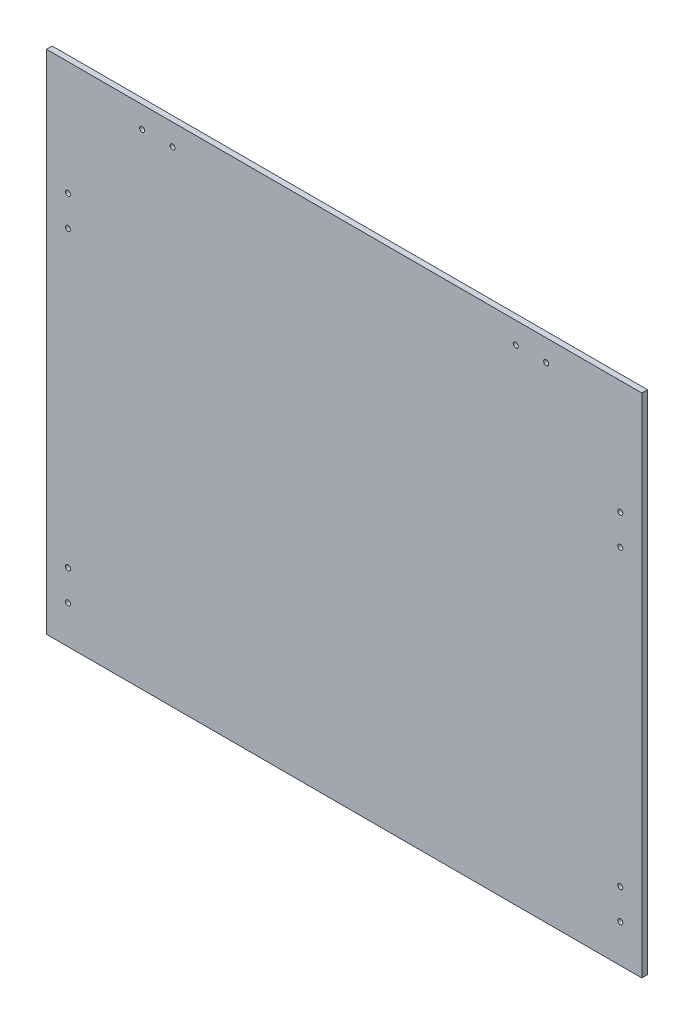
ISO-10303-21;
HEADER;
FILE_DESCRIPTION(('STEP AP214'),'2;1');
FILE_NAME('part.step','',(''),(''),'','','');
FILE_SCHEMA(('AUTOMOTIVE_DESIGN { 1 0 10303 214 1 1 1 1 }'));
ENDSEC;
DATA;
#1=APPLICATION_CONTEXT('core data for automotive mechanical design processes');
#2=APPLICATION_PROTOCOL_DEFINITION('international standard','automotive_design',2000,#1);
#3=PRODUCT_CONTEXT('',#1,'mechanical');
#4=PRODUCT('Part','Part','',(#3));
#5=PRODUCT_RELATED_PRODUCT_CATEGORY('part','',(#4));
#6=PRODUCT_DEFINITION_FORMATION('','',#4);
#7=PRODUCT_DEFINITION_CONTEXT('part definition',#1,'design');
#8=PRODUCT_DEFINITION('design','',#6,#7);
#9=PRODUCT_DEFINITION_SHAPE('','',#8);
#10=(LENGTH_UNIT() NAMED_UNIT(*) SI_UNIT(.MILLI.,.METRE.));
#11=(NAMED_UNIT(*) PLANE_ANGLE_UNIT() SI_UNIT($,.RADIAN.));
#12=(NAMED_UNIT(*) SI_UNIT($,.STERADIAN.) SOLID_ANGLE_UNIT());
#13=UNCERTAINTY_MEASURE_WITH_UNIT(LENGTH_MEASURE(1.E-05),#10,'distance_accuracy_value','');
#14=(GEOMETRIC_REPRESENTATION_CONTEXT(3) GLOBAL_UNCERTAINTY_ASSIGNED_CONTEXT((#13)) GLOBAL_UNIT_ASSIGNED_CONTEXT((#10,
#11,#12)) REPRESENTATION_CONTEXT('',''));
#15=CARTESIAN_POINT('',(0.,0.,0.));
#16=DIRECTION('',(0.,0.,1.));
#17=DIRECTION('',(1.,0.,0.));
#18=AXIS2_PLACEMENT_3D('',#15,#16,#17);
#19=CARTESIAN_POINT('',(0.,0.,4.5));
#20=DIRECTION('',(1.,0.,0.));
#21=DIRECTION('',(0.,1.,0.));
#22=AXIS2_PLACEMENT_3D('',#19,#20,#21);
#23=PLANE('',#22);
#24=DIRECTION('',(0.,-1.,0.));
#25=VECTOR('',#24,1.);
#26=CARTESIAN_POINT('',(0.,0.,0.));
#27=LINE('',#26,#25);
#28=CARTESIAN_POINT('',(0.,400.,0.));
#29=VERTEX_POINT('',#28);
#30=CARTESIAN_POINT('',(0.,0.,0.));
#31=VERTEX_POINT('',#30);
#32=EDGE_CURVE('E104',#29,#31,#27,.T.);
#33=ORIENTED_EDGE('',*,*,#32,.T.);
#34=DIRECTION('',(0.,0.,-1.));
#35=VECTOR('',#34,1.);
#36=CARTESIAN_POINT('',(0.,0.,4.5));
#37=LINE('',#36,#35);
#38=CARTESIAN_POINT('',(0.,0.,4.5));
#39=VERTEX_POINT('',#38);
#40=EDGE_CURVE('E11',#39,#31,#37,.T.);
#41=ORIENTED_EDGE('',*,*,#40,.F.);
#42=DIRECTION('',(0.,-1.,0.));
#43=VECTOR('',#42,1.);
#44=CARTESIAN_POINT('',(0.,0.,4.5));
#45=LINE('',#44,#43);
#46=CARTESIAN_POINT('',(0.,400.,4.5));
#47=VERTEX_POINT('',#46);
#48=EDGE_CURVE('E91',#47,#39,#45,.T.);
#49=ORIENTED_EDGE('',*,*,#48,.F.);
#50=DIRECTION('',(0.,0.,-1.));
#51=VECTOR('',#50,1.);
#52=CARTESIAN_POINT('',(0.,400.,4.5));
#53=LINE('',#52,#51);
#54=EDGE_CURVE('E100',#47,#29,#53,.T.);
#55=ORIENTED_EDGE('',*,*,#54,.T.);
#56=EDGE_LOOP('',(#33,#41,#49,#55));
#57=FACE_BOUND('',#56,.T.);
#58=ADVANCED_FACE('F38',(#57),#23,.F.);
#59=CARTESIAN_POINT('',(0.,0.,4.5));
#60=DIRECTION('',(0.,1.,0.));
#61=DIRECTION('',(0.,0.,1.));
#62=AXIS2_PLACEMENT_3D('',#59,#60,#61);
#63=PLANE('',#62);
#64=DIRECTION('',(1.,0.,0.));
#65=VECTOR('',#64,1.);
#66=CARTESIAN_POINT('',(0.,0.,0.));
#67=LINE('',#66,#65);
#68=CARTESIAN_POINT('',(470.,0.,0.));
#69=VERTEX_POINT('',#68);
#70=EDGE_CURVE('E95',#31,#69,#67,.T.);
#71=ORIENTED_EDGE('',*,*,#70,.T.);
#72=DIRECTION('',(0.,0.,-1.));
#73=VECTOR('',#72,1.);
#74=CARTESIAN_POINT('',(470.,0.,4.5));
#75=LINE('',#74,#73);
#76=CARTESIAN_POINT('',(470.,0.,4.5));
#77=VERTEX_POINT('',#76);
#78=EDGE_CURVE('E47',#77,#69,#75,.T.);
#79=ORIENTED_EDGE('',*,*,#78,.F.);
#80=DIRECTION('',(1.,0.,0.));
#81=VECTOR('',#80,1.);
#82=CARTESIAN_POINT('',(0.,0.,4.5));
#83=LINE('',#82,#81);
#84=EDGE_CURVE('E86',#39,#77,#83,.T.);
#85=ORIENTED_EDGE('',*,*,#84,.F.);
#86=ORIENTED_EDGE('',*,*,#40,.T.);
#87=EDGE_LOOP('',(#71,#79,#85,#86));
#88=FACE_BOUND('',#87,.T.);
#89=ADVANCED_FACE('F94',(#88),#63,.F.);
#90=CARTESIAN_POINT('',(470.,0.,4.5));
#91=DIRECTION('',(-1.,0.,0.));
#92=DIRECTION('',(0.,0.,1.));
#93=AXIS2_PLACEMENT_3D('',#90,#91,#92);
#94=PLANE('',#93);
#95=DIRECTION('',(0.,1.,0.));
#96=VECTOR('',#95,1.);
#97=CARTESIAN_POINT('',(470.,0.,0.));
#98=LINE('',#97,#96);
#99=CARTESIAN_POINT('',(470.,400.,0.));
#100=VERTEX_POINT('',#99);
#101=EDGE_CURVE('E73',#69,#100,#98,.T.);
#102=ORIENTED_EDGE('',*,*,#101,.T.);
#103=DIRECTION('',(0.,0.,-1.));
#104=VECTOR('',#103,1.);
#105=CARTESIAN_POINT('',(470.,400.,4.5));
#106=LINE('',#105,#104);
#107=CARTESIAN_POINT('',(470.,400.,4.5));
#108=VERTEX_POINT('',#107);
#109=EDGE_CURVE('E96',#108,#100,#106,.T.);
#110=ORIENTED_EDGE('',*,*,#109,.F.);
#111=DIRECTION('',(0.,1.,0.));
#112=VECTOR('',#111,1.);
#113=CARTESIAN_POINT('',(470.,0.,4.5));
#114=LINE('',#113,#112);
#115=EDGE_CURVE('E89',#77,#108,#114,.T.);
#116=ORIENTED_EDGE('',*,*,#115,.F.);
#117=ORIENTED_EDGE('',*,*,#78,.T.);
#118=EDGE_LOOP('',(#102,#110,#116,#117));
#119=FACE_BOUND('',#118,.T.);
#120=ADVANCED_FACE('F98',(#119),#94,.F.);
#121=CARTESIAN_POINT('',(0.,400.,4.5));
#122=DIRECTION('',(0.,-1.,0.));
#123=DIRECTION('',(0.,0.,-1.));
#124=AXIS2_PLACEMENT_3D('',#121,#122,#123);
#125=PLANE('',#124);
#126=DIRECTION('',(-1.,0.,0.));
#127=VECTOR('',#126,1.);
#128=CARTESIAN_POINT('',(0.,400.,0.));
#129=LINE('',#128,#127);
#130=EDGE_CURVE('E79',#100,#29,#129,.T.);
#131=ORIENTED_EDGE('',*,*,#130,.T.);
#132=ORIENTED_EDGE('',*,*,#54,.F.);
#133=DIRECTION('',(-1.,0.,0.));
#134=VECTOR('',#133,1.);
#135=CARTESIAN_POINT('',(0.,400.,4.5));
#136=LINE('',#135,#134);
#137=EDGE_CURVE('E56',#108,#47,#136,.T.);
#138=ORIENTED_EDGE('',*,*,#137,.F.);
#139=ORIENTED_EDGE('',*,*,#109,.T.);
#140=EDGE_LOOP('',(#131,#132,#138,#139));
#141=FACE_BOUND('',#140,.T.);
#142=ADVANCED_FACE('F180',(#141),#125,.F.);
#143=CARTESIAN_POINT('',(0.,0.,4.5));
#144=DIRECTION('',(0.,0.,-1.));
#145=DIRECTION('',(-1.,0.,0.));
#146=AXIS2_PLACEMENT_3D('',#143,#144,#145);
#147=PLANE('',#146);
#148=CARTESIAN_POINT('',(453.,286.,4.5));
#149=DIRECTION('',(0.,0.,1.));
#150=DIRECTION('',(-1.,0.,0.));
#151=AXIS2_PLACEMENT_3D('',#148,#149,#150);
#152=CIRCLE('',#151,2.);
#153=CARTESIAN_POINT('',(451.,286.,4.5));
#154=VERTEX_POINT('',#153);
#155=EDGE_CURVE('E338',#154,#154,#152,.T.);
#156=ORIENTED_EDGE('',*,*,#155,.F.);
#157=EDGE_LOOP('',(#156));
#158=FACE_BOUND('',#157,.T.);
#159=CARTESIAN_POINT('',(453.,54.0000000000001,4.5));
#160=DIRECTION('',(0.,0.,1.));
#161=DIRECTION('',(-1.,0.,0.));
#162=AXIS2_PLACEMENT_3D('',#159,#160,#161);
#163=CIRCLE('',#162,2.);
#164=CARTESIAN_POINT('',(451.,54.0000000000001,4.5));
#165=VERTEX_POINT('',#164);
#166=EDGE_CURVE('E335',#165,#165,#163,.T.);
#167=ORIENTED_EDGE('',*,*,#166,.F.);
#168=EDGE_LOOP('',(#167));
#169=FACE_BOUND('',#168,.T.);
#170=CARTESIAN_POINT('',(453.,30.,4.5));
#171=DIRECTION('',(0.,0.,1.));
#172=DIRECTION('',(-1.,0.,0.));
#173=AXIS2_PLACEMENT_3D('',#170,#171,#172);
#174=CIRCLE('',#173,2.);
#175=CARTESIAN_POINT('',(451.,30.,4.5));
#176=VERTEX_POINT('',#175);
#177=EDGE_CURVE('E337',#176,#176,#174,.T.);
#178=ORIENTED_EDGE('',*,*,#177,.F.);
#179=EDGE_LOOP('',(#178));
#180=FACE_BOUND('',#179,.T.);
#181=CARTESIAN_POINT('',(17.0000000000001,30.,4.5));
#182=DIRECTION('',(0.,0.,1.));
#183=DIRECTION('',(1.,0.,0.));
#184=AXIS2_PLACEMENT_3D('',#181,#182,#183);
#185=CIRCLE('',#184,2.00000000000001);
#186=CARTESIAN_POINT('',(19.0000000000001,30.,4.5));
#187=VERTEX_POINT('',#186);
#188=EDGE_CURVE('E341',#187,#187,#185,.T.);
#189=ORIENTED_EDGE('',*,*,#188,.F.);
#190=EDGE_LOOP('',(#189));
#191=FACE_BOUND('',#190,.T.);
#192=CARTESIAN_POINT('',(17.0000000000001,54.,4.5));
#193=DIRECTION('',(0.,0.,1.));
#194=DIRECTION('',(1.,0.,0.));
#195=AXIS2_PLACEMENT_3D('',#192,#193,#194);
#196=CIRCLE('',#195,2.00000000000001);
#197=CARTESIAN_POINT('',(19.0000000000001,54.,4.5));
#198=VERTEX_POINT('',#197);
#199=EDGE_CURVE('E357',#198,#198,#196,.T.);
#200=ORIENTED_EDGE('',*,*,#199,.F.);
#201=EDGE_LOOP('',(#200));
#202=FACE_BOUND('',#201,.T.);
#203=CARTESIAN_POINT('',(17.,286.,4.5));
#204=DIRECTION('',(0.,0.,1.));
#205=DIRECTION('',(1.,0.,0.));
#206=AXIS2_PLACEMENT_3D('',#203,#204,#205);
#207=CIRCLE('',#206,2.00000000000001);
#208=CARTESIAN_POINT('',(19.,286.,4.5));
#209=VERTEX_POINT('',#208);
#210=EDGE_CURVE('E354',#209,#209,#207,.T.);
#211=ORIENTED_EDGE('',*,*,#210,.F.);
#212=EDGE_LOOP('',(#211));
#213=FACE_BOUND('',#212,.T.);
#214=CARTESIAN_POINT('',(17.,310.,4.5));
#215=DIRECTION('',(0.,0.,1.));
#216=DIRECTION('',(1.,0.,0.));
#217=AXIS2_PLACEMENT_3D('',#214,#215,#216);
#218=CIRCLE('',#217,2.);
#219=CARTESIAN_POINT('',(19.,310.,4.5));
#220=VERTEX_POINT('',#219);
#221=EDGE_CURVE('E351',#220,#220,#218,.T.);
#222=ORIENTED_EDGE('',*,*,#221,.F.);
#223=EDGE_LOOP('',(#222));
#224=FACE_BOUND('',#223,.T.);
#225=CARTESIAN_POINT('',(75.5000000000001,383.,4.5));
#226=DIRECTION('',(0.,0.,1.));
#227=DIRECTION('',(1.,0.,0.));
#228=AXIS2_PLACEMENT_3D('',#225,#226,#227);
#229=CIRCLE('',#228,2.);
#230=CARTESIAN_POINT('',(77.5000000000001,383.,4.5));
#231=VERTEX_POINT('',#230);
#232=EDGE_CURVE('E348',#231,#231,#229,.T.);
#233=ORIENTED_EDGE('',*,*,#232,.F.);
#234=EDGE_LOOP('',(#233));
#235=FACE_BOUND('',#234,.T.);
#236=CARTESIAN_POINT('',(453.,310.,4.5));
#237=DIRECTION('',(0.,0.,1.));
#238=DIRECTION('',(-1.,0.,0.));
#239=AXIS2_PLACEMENT_3D('',#236,#237,#238);
#240=CIRCLE('',#239,2.);
#241=CARTESIAN_POINT('',(451.,310.,4.5));
#242=VERTEX_POINT('',#241);
#243=EDGE_CURVE('E344',#242,#242,#240,.T.);
#244=ORIENTED_EDGE('',*,*,#243,.F.);
#245=EDGE_LOOP('',(#244));
#246=FACE_BOUND('',#245,.T.);
#247=CARTESIAN_POINT('',(394.5,383.,4.5));
#248=DIRECTION('',(0.,0.,1.));
#249=DIRECTION('',(-1.,0.,0.));
#250=AXIS2_PLACEMENT_3D('',#247,#248,#249);
#251=CIRCLE('',#250,2.);
#252=CARTESIAN_POINT('',(392.5,383.,4.5));
#253=VERTEX_POINT('',#252);
#254=EDGE_CURVE('E373',#253,#253,#251,.T.);
#255=ORIENTED_EDGE('',*,*,#254,.F.);
#256=EDGE_LOOP('',(#255));
#257=FACE_BOUND('',#256,.T.);
#258=CARTESIAN_POINT('',(370.5,383.,4.5));
#259=DIRECTION('',(0.,0.,1.));
#260=DIRECTION('',(-1.,0.,0.));
#261=AXIS2_PLACEMENT_3D('',#258,#259,#260);
#262=CIRCLE('',#261,2.);
#263=CARTESIAN_POINT('',(368.5,383.,4.5));
#264=VERTEX_POINT('',#263);
#265=EDGE_CURVE('E370',#264,#264,#262,.T.);
#266=ORIENTED_EDGE('',*,*,#265,.F.);
#267=EDGE_LOOP('',(#266));
#268=FACE_BOUND('',#267,.T.);
#269=CARTESIAN_POINT('',(99.5000000000001,383.,4.5));
#270=DIRECTION('',(0.,0.,1.));
#271=DIRECTION('',(1.,0.,0.));
#272=AXIS2_PLACEMENT_3D('',#269,#270,#271);
#273=CIRCLE('',#272,2.);
#274=CARTESIAN_POINT('',(101.5,383.,4.5));
#275=VERTEX_POINT('',#274);
#276=EDGE_CURVE('E116',#275,#275,#273,.T.);
#277=ORIENTED_EDGE('',*,*,#276,.F.);
#278=EDGE_LOOP('',(#277));
#279=FACE_BOUND('',#278,.T.);
#280=ORIENTED_EDGE('',*,*,#48,.T.);
#281=ORIENTED_EDGE('',*,*,#84,.T.);
#282=ORIENTED_EDGE('',*,*,#115,.T.);
#283=ORIENTED_EDGE('',*,*,#137,.T.);
#284=EDGE_LOOP('',(#280,#281,#282,#283));
#285=FACE_BOUND('',#284,.T.);
#286=ADVANCED_FACE('F87',(#158,#169,#180,#191,#202,#213,#224,#235,#246,#257,#268,#279,#285),
#147,.F.);
#287=CARTESIAN_POINT('',(0.,0.,0.));
#288=DIRECTION('',(0.,0.,-1.));
#289=DIRECTION('',(-1.,0.,0.));
#290=AXIS2_PLACEMENT_3D('',#287,#288,#289);
#291=PLANE('',#290);
#292=CARTESIAN_POINT('',(453.,286.,0.));
#293=DIRECTION('',(0.,0.,-1.));
#294=DIRECTION('',(-1.,0.,0.));
#295=AXIS2_PLACEMENT_3D('',#292,#293,#294);
#296=CIRCLE('',#295,2.);
#297=CARTESIAN_POINT('',(451.,286.,0.));
#298=VERTEX_POINT('',#297);
#299=EDGE_CURVE('E41',#298,#298,#296,.T.);
#300=ORIENTED_EDGE('',*,*,#299,.F.);
#301=EDGE_LOOP('',(#300));
#302=FACE_BOUND('',#301,.T.);
#303=CARTESIAN_POINT('',(453.,54.0000000000001,0.));
#304=DIRECTION('',(0.,0.,-1.));
#305=DIRECTION('',(-1.,0.,0.));
#306=AXIS2_PLACEMENT_3D('',#303,#304,#305);
#307=CIRCLE('',#306,2.);
#308=CARTESIAN_POINT('',(451.,54.0000000000001,0.));
#309=VERTEX_POINT('',#308);
#310=EDGE_CURVE('E142',#309,#309,#307,.T.);
#311=ORIENTED_EDGE('',*,*,#310,.F.);
#312=EDGE_LOOP('',(#311));
#313=FACE_BOUND('',#312,.T.);
#314=CARTESIAN_POINT('',(453.,30.,0.));
#315=DIRECTION('',(0.,0.,-1.));
#316=DIRECTION('',(-1.,0.,0.));
#317=AXIS2_PLACEMENT_3D('',#314,#315,#316);
#318=CIRCLE('',#317,2.);
#319=CARTESIAN_POINT('',(451.,30.,0.));
#320=VERTEX_POINT('',#319);
#321=EDGE_CURVE('E140',#320,#320,#318,.T.);
#322=ORIENTED_EDGE('',*,*,#321,.F.);
#323=EDGE_LOOP('',(#322));
#324=FACE_BOUND('',#323,.T.);
#325=CARTESIAN_POINT('',(17.0000000000001,30.,0.));
#326=DIRECTION('',(0.,0.,-1.));
#327=DIRECTION('',(-1.,0.,0.));
#328=AXIS2_PLACEMENT_3D('',#325,#326,#327);
#329=CIRCLE('',#328,2.00000000000001);
#330=CARTESIAN_POINT('',(15.0000000000001,30.,0.));
#331=VERTEX_POINT('',#330);
#332=EDGE_CURVE('E137',#331,#331,#329,.T.);
#333=ORIENTED_EDGE('',*,*,#332,.F.);
#334=EDGE_LOOP('',(#333));
#335=FACE_BOUND('',#334,.T.);
#336=CARTESIAN_POINT('',(17.0000000000001,54.,0.));
#337=DIRECTION('',(0.,0.,-1.));
#338=DIRECTION('',(-1.,0.,0.));
#339=AXIS2_PLACEMENT_3D('',#336,#337,#338);
#340=CIRCLE('',#339,2.00000000000001);
#341=CARTESIAN_POINT('',(15.,54.,0.));
#342=VERTEX_POINT('',#341);
#343=EDGE_CURVE('E134',#342,#342,#340,.T.);
#344=ORIENTED_EDGE('',*,*,#343,.F.);
#345=EDGE_LOOP('',(#344));
#346=FACE_BOUND('',#345,.T.);
#347=CARTESIAN_POINT('',(17.,286.,0.));
#348=DIRECTION('',(0.,0.,-1.));
#349=DIRECTION('',(-1.,0.,0.));
#350=AXIS2_PLACEMENT_3D('',#347,#348,#349);
#351=CIRCLE('',#350,2.00000000000001);
#352=CARTESIAN_POINT('',(15.,286.,0.));
#353=VERTEX_POINT('',#352);
#354=EDGE_CURVE('E131',#353,#353,#351,.T.);
#355=ORIENTED_EDGE('',*,*,#354,.F.);
#356=EDGE_LOOP('',(#355));
#357=FACE_BOUND('',#356,.T.);
#358=CARTESIAN_POINT('',(17.,310.,0.));
#359=DIRECTION('',(0.,0.,-1.));
#360=DIRECTION('',(-1.,0.,0.));
#361=AXIS2_PLACEMENT_3D('',#358,#359,#360);
#362=CIRCLE('',#361,2.);
#363=CARTESIAN_POINT('',(15.,310.,0.));
#364=VERTEX_POINT('',#363);
#365=EDGE_CURVE('E128',#364,#364,#362,.T.);
#366=ORIENTED_EDGE('',*,*,#365,.F.);
#367=EDGE_LOOP('',(#366));
#368=FACE_BOUND('',#367,.T.);
#369=CARTESIAN_POINT('',(75.5000000000001,383.,0.));
#370=DIRECTION('',(0.,0.,-1.));
#371=DIRECTION('',(-1.,0.,0.));
#372=AXIS2_PLACEMENT_3D('',#369,#370,#371);
#373=CIRCLE('',#372,2.);
#374=CARTESIAN_POINT('',(73.5000000000001,383.,0.));
#375=VERTEX_POINT('',#374);
#376=EDGE_CURVE('E125',#375,#375,#373,.T.);
#377=ORIENTED_EDGE('',*,*,#376,.F.);
#378=EDGE_LOOP('',(#377));
#379=FACE_BOUND('',#378,.T.);
#380=CARTESIAN_POINT('',(453.,310.,0.));
#381=DIRECTION('',(0.,0.,-1.));
#382=DIRECTION('',(-1.,0.,0.));
#383=AXIS2_PLACEMENT_3D('',#380,#381,#382);
#384=CIRCLE('',#383,2.);
#385=CARTESIAN_POINT('',(451.,310.,0.));
#386=VERTEX_POINT('',#385);
#387=EDGE_CURVE('E122',#386,#386,#384,.T.);
#388=ORIENTED_EDGE('',*,*,#387,.F.);
#389=EDGE_LOOP('',(#388));
#390=FACE_BOUND('',#389,.T.);
#391=CARTESIAN_POINT('',(394.5,383.,0.));
#392=DIRECTION('',(0.,0.,-1.));
#393=DIRECTION('',(-1.,0.,0.));
#394=AXIS2_PLACEMENT_3D('',#391,#392,#393);
#395=CIRCLE('',#394,2.);
#396=CARTESIAN_POINT('',(392.5,383.,0.));
#397=VERTEX_POINT('',#396);
#398=EDGE_CURVE('E119',#397,#397,#395,.T.);
#399=ORIENTED_EDGE('',*,*,#398,.F.);
#400=EDGE_LOOP('',(#399));
#401=FACE_BOUND('',#400,.T.);
#402=CARTESIAN_POINT('',(370.5,383.,0.));
#403=DIRECTION('',(0.,0.,-1.));
#404=DIRECTION('',(-1.,0.,0.));
#405=AXIS2_PLACEMENT_3D('',#402,#403,#404);
#406=CIRCLE('',#405,2.);
#407=CARTESIAN_POINT('',(368.5,383.,0.));
#408=VERTEX_POINT('',#407);
#409=EDGE_CURVE('E115',#408,#408,#406,.T.);
#410=ORIENTED_EDGE('',*,*,#409,.F.);
#411=EDGE_LOOP('',(#410));
#412=FACE_BOUND('',#411,.T.);
#413=CARTESIAN_POINT('',(99.5000000000001,383.,0.));
#414=DIRECTION('',(0.,0.,-1.));
#415=DIRECTION('',(-1.,0.,0.));
#416=AXIS2_PLACEMENT_3D('',#413,#414,#415);
#417=CIRCLE('',#416,2.);
#418=CARTESIAN_POINT('',(97.5000000000001,383.,0.));
#419=VERTEX_POINT('',#418);
#420=EDGE_CURVE('E112',#419,#419,#417,.T.);
#421=ORIENTED_EDGE('',*,*,#420,.F.);
#422=EDGE_LOOP('',(#421));
#423=FACE_BOUND('',#422,.T.);
#424=ORIENTED_EDGE('',*,*,#32,.F.);
#425=ORIENTED_EDGE('',*,*,#130,.F.);
#426=ORIENTED_EDGE('',*,*,#101,.F.);
#427=ORIENTED_EDGE('',*,*,#70,.F.);
#428=EDGE_LOOP('',(#424,#425,#426,#427));
#429=FACE_BOUND('',#428,.T.);
#430=ADVANCED_FACE('F152',(#302,#313,#324,#335,#346,#357,#368,#379,#390,#401,#412,#423,#429),
#291,.T.);
#431=CARTESIAN_POINT('',(99.5000000000001,383.,-5.5));
#432=DIRECTION('',(0.,0.,1.));
#433=DIRECTION('',(1.,0.,0.));
#434=AXIS2_PLACEMENT_3D('',#431,#432,#433);
#435=CYLINDRICAL_SURFACE('',#434,2.);
#436=ORIENTED_EDGE('',*,*,#420,.T.);
#437=EDGE_LOOP('',(#436));
#438=FACE_BOUND('',#437,.T.);
#439=ORIENTED_EDGE('',*,*,#276,.T.);
#440=EDGE_LOOP('',(#439));
#441=FACE_BOUND('',#440,.T.);
#442=ADVANCED_FACE('F155',(#438,#441),#435,.F.);
#443=CARTESIAN_POINT('',(370.5,383.,-5.5));
#444=DIRECTION('',(0.,0.,1.));
#445=DIRECTION('',(1.,0.,0.));
#446=AXIS2_PLACEMENT_3D('',#443,#444,#445);
#447=CYLINDRICAL_SURFACE('',#446,2.);
#448=ORIENTED_EDGE('',*,*,#409,.T.);
#449=EDGE_LOOP('',(#448));
#450=FACE_BOUND('',#449,.T.);
#451=ORIENTED_EDGE('',*,*,#265,.T.);
#452=EDGE_LOOP('',(#451));
#453=FACE_BOUND('',#452,.T.);
#454=ADVANCED_FACE('F221',(#450,#453),#447,.F.);
#455=CARTESIAN_POINT('',(394.5,383.,-5.5));
#456=DIRECTION('',(0.,0.,1.));
#457=DIRECTION('',(1.,0.,0.));
#458=AXIS2_PLACEMENT_3D('',#455,#456,#457);
#459=CYLINDRICAL_SURFACE('',#458,2.);
#460=ORIENTED_EDGE('',*,*,#398,.T.);
#461=EDGE_LOOP('',(#460));
#462=FACE_BOUND('',#461,.T.);
#463=ORIENTED_EDGE('',*,*,#254,.T.);
#464=EDGE_LOOP('',(#463));
#465=FACE_BOUND('',#464,.T.);
#466=ADVANCED_FACE('F231',(#462,#465),#459,.F.);
#467=CARTESIAN_POINT('',(453.,310.,-5.5));
#468=DIRECTION('',(0.,0.,1.));
#469=DIRECTION('',(1.,0.,0.));
#470=AXIS2_PLACEMENT_3D('',#467,#468,#469);
#471=CYLINDRICAL_SURFACE('',#470,2.);
#472=ORIENTED_EDGE('',*,*,#387,.T.);
#473=EDGE_LOOP('',(#472));
#474=FACE_BOUND('',#473,.T.);
#475=ORIENTED_EDGE('',*,*,#243,.T.);
#476=EDGE_LOOP('',(#475));
#477=FACE_BOUND('',#476,.T.);
#478=ADVANCED_FACE('F241',(#474,#477),#471,.F.);
#479=CARTESIAN_POINT('',(75.5000000000001,383.,-5.5));
#480=DIRECTION('',(0.,0.,1.));
#481=DIRECTION('',(1.,0.,0.));
#482=AXIS2_PLACEMENT_3D('',#479,#480,#481);
#483=CYLINDRICAL_SURFACE('',#482,2.);
#484=ORIENTED_EDGE('',*,*,#376,.T.);
#485=EDGE_LOOP('',(#484));
#486=FACE_BOUND('',#485,.T.);
#487=ORIENTED_EDGE('',*,*,#232,.T.);
#488=EDGE_LOOP('',(#487));
#489=FACE_BOUND('',#488,.T.);
#490=ADVANCED_FACE('F251',(#486,#489),#483,.F.);
#491=CARTESIAN_POINT('',(17.,310.,-5.5));
#492=DIRECTION('',(0.,0.,1.));
#493=DIRECTION('',(1.,0.,0.));
#494=AXIS2_PLACEMENT_3D('',#491,#492,#493);
#495=CYLINDRICAL_SURFACE('',#494,2.);
#496=ORIENTED_EDGE('',*,*,#365,.T.);
#497=EDGE_LOOP('',(#496));
#498=FACE_BOUND('',#497,.T.);
#499=ORIENTED_EDGE('',*,*,#221,.T.);
#500=EDGE_LOOP('',(#499));
#501=FACE_BOUND('',#500,.T.);
#502=ADVANCED_FACE('F261',(#498,#501),#495,.F.);
#503=CARTESIAN_POINT('',(17.,286.,-5.5));
#504=DIRECTION('',(0.,0.,1.));
#505=DIRECTION('',(1.,0.,0.));
#506=AXIS2_PLACEMENT_3D('',#503,#504,#505);
#507=CYLINDRICAL_SURFACE('',#506,2.00000000000001);
#508=ORIENTED_EDGE('',*,*,#354,.T.);
#509=EDGE_LOOP('',(#508));
#510=FACE_BOUND('',#509,.T.);
#511=ORIENTED_EDGE('',*,*,#210,.T.);
#512=EDGE_LOOP('',(#511));
#513=FACE_BOUND('',#512,.T.);
#514=ADVANCED_FACE('F271',(#510,#513),#507,.F.);
#515=CARTESIAN_POINT('',(17.0000000000001,54.,-5.5));
#516=DIRECTION('',(0.,0.,1.));
#517=DIRECTION('',(1.,0.,0.));
#518=AXIS2_PLACEMENT_3D('',#515,#516,#517);
#519=CYLINDRICAL_SURFACE('',#518,2.00000000000001);
#520=ORIENTED_EDGE('',*,*,#343,.T.);
#521=EDGE_LOOP('',(#520));
#522=FACE_BOUND('',#521,.T.);
#523=ORIENTED_EDGE('',*,*,#199,.T.);
#524=EDGE_LOOP('',(#523));
#525=FACE_BOUND('',#524,.T.);
#526=ADVANCED_FACE('F281',(#522,#525),#519,.F.);
#527=CARTESIAN_POINT('',(17.0000000000001,30.,-5.5));
#528=DIRECTION('',(0.,0.,1.));
#529=DIRECTION('',(1.,0.,0.));
#530=AXIS2_PLACEMENT_3D('',#527,#528,#529);
#531=CYLINDRICAL_SURFACE('',#530,2.00000000000001);
#532=ORIENTED_EDGE('',*,*,#332,.T.);
#533=EDGE_LOOP('',(#532));
#534=FACE_BOUND('',#533,.T.);
#535=ORIENTED_EDGE('',*,*,#188,.T.);
#536=EDGE_LOOP('',(#535));
#537=FACE_BOUND('',#536,.T.);
#538=ADVANCED_FACE('F291',(#534,#537),#531,.F.);
#539=CARTESIAN_POINT('',(453.,30.,-5.5));
#540=DIRECTION('',(0.,0.,1.));
#541=DIRECTION('',(1.,0.,0.));
#542=AXIS2_PLACEMENT_3D('',#539,#540,#541);
#543=CYLINDRICAL_SURFACE('',#542,2.);
#544=ORIENTED_EDGE('',*,*,#321,.T.);
#545=EDGE_LOOP('',(#544));
#546=FACE_BOUND('',#545,.T.);
#547=ORIENTED_EDGE('',*,*,#177,.T.);
#548=EDGE_LOOP('',(#547));
#549=FACE_BOUND('',#548,.T.);
#550=ADVANCED_FACE('F301',(#546,#549),#543,.F.);
#551=CARTESIAN_POINT('',(453.,54.0000000000001,-5.5));
#552=DIRECTION('',(0.,0.,1.));
#553=DIRECTION('',(1.,0.,0.));
#554=AXIS2_PLACEMENT_3D('',#551,#552,#553);
#555=CYLINDRICAL_SURFACE('',#554,2.);
#556=ORIENTED_EDGE('',*,*,#310,.T.);
#557=EDGE_LOOP('',(#556));
#558=FACE_BOUND('',#557,.T.);
#559=ORIENTED_EDGE('',*,*,#166,.T.);
#560=EDGE_LOOP('',(#559));
#561=FACE_BOUND('',#560,.T.);
#562=ADVANCED_FACE('F311',(#558,#561),#555,.F.);
#563=CARTESIAN_POINT('',(453.,286.,-5.5));
#564=DIRECTION('',(0.,0.,1.));
#565=DIRECTION('',(1.,0.,0.));
#566=AXIS2_PLACEMENT_3D('',#563,#564,#565);
#567=CYLINDRICAL_SURFACE('',#566,2.);
#568=ORIENTED_EDGE('',*,*,#299,.T.);
#569=EDGE_LOOP('',(#568));
#570=FACE_BOUND('',#569,.T.);
#571=ORIENTED_EDGE('',*,*,#155,.T.);
#572=EDGE_LOOP('',(#571));
#573=FACE_BOUND('',#572,.T.);
#574=ADVANCED_FACE('F149',(#570,#573),#567,.F.);
#575=CLOSED_SHELL('',(#58,#89,#120,#142,#286,#430,#442,#454,#466,#478,#490,#502,#514,#526,#538,
#550,#562,#574));
#576=MANIFOLD_SOLID_BREP('B2',#575);
#577=ADVANCED_BREP_SHAPE_REPRESENTATION('',(#18,#576),#14);
#578=SHAPE_DEFINITION_REPRESENTATION(#9,#577);
ENDSEC;
END-ISO-10303-21;
